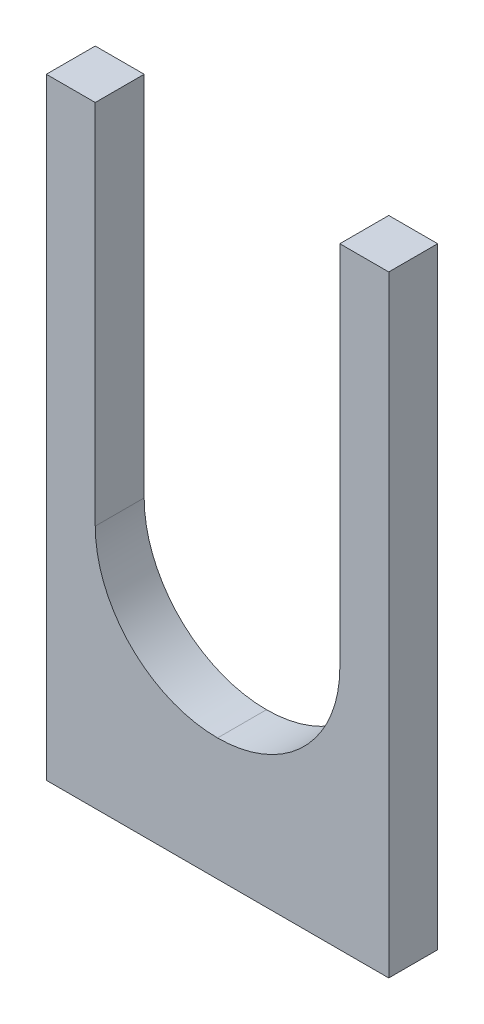
ISO-10303-21;
HEADER;
FILE_DESCRIPTION(('STEP AP214'),'2;1');
FILE_NAME('part.step','',(''),(''),'','','');
FILE_SCHEMA(('AUTOMOTIVE_DESIGN { 1 0 10303 214 1 1 1 1 }'));
ENDSEC;
DATA;
#1=APPLICATION_CONTEXT('core data for automotive mechanical design processes');
#2=APPLICATION_PROTOCOL_DEFINITION('international standard','automotive_design',2000,#1);
#3=PRODUCT_CONTEXT('',#1,'mechanical');
#4=PRODUCT('Part','Part','',(#3));
#5=PRODUCT_RELATED_PRODUCT_CATEGORY('part','',(#4));
#6=PRODUCT_DEFINITION_FORMATION('','',#4);
#7=PRODUCT_DEFINITION_CONTEXT('part definition',#1,'design');
#8=PRODUCT_DEFINITION('design','',#6,#7);
#9=PRODUCT_DEFINITION_SHAPE('','',#8);
#10=(LENGTH_UNIT() NAMED_UNIT(*) SI_UNIT(.MILLI.,.METRE.));
#11=(NAMED_UNIT(*) PLANE_ANGLE_UNIT() SI_UNIT($,.RADIAN.));
#12=(NAMED_UNIT(*) SI_UNIT($,.STERADIAN.) SOLID_ANGLE_UNIT());
#13=UNCERTAINTY_MEASURE_WITH_UNIT(LENGTH_MEASURE(1.E-05),#10,'distance_accuracy_value','');
#14=(GEOMETRIC_REPRESENTATION_CONTEXT(3) GLOBAL_UNCERTAINTY_ASSIGNED_CONTEXT((#13)) GLOBAL_UNIT_ASSIGNED_CONTEXT((#10,
#11,#12)) REPRESENTATION_CONTEXT('',''));
#15=CARTESIAN_POINT('',(0.,0.,0.));
#16=DIRECTION('',(0.,0.,1.));
#17=DIRECTION('',(1.,0.,0.));
#18=AXIS2_PLACEMENT_3D('',#15,#16,#17);
#19=CARTESIAN_POINT('',(35.,0.,10.));
#20=DIRECTION('',(-1.,0.,0.));
#21=DIRECTION('',(0.,0.,1.));
#22=AXIS2_PLACEMENT_3D('',#19,#20,#21);
#23=PLANE('',#22);
#24=DIRECTION('',(0.,1.,0.));
#25=VECTOR('',#24,1.);
#26=CARTESIAN_POINT('',(35.,0.,0.));
#27=LINE('',#26,#25);
#28=CARTESIAN_POINT('',(35.,-75.,0.));
#29=VERTEX_POINT('',#28);
#30=CARTESIAN_POINT('',(35.,50.,0.));
#31=VERTEX_POINT('',#30);
#32=EDGE_CURVE('E136',#29,#31,#27,.T.);
#33=ORIENTED_EDGE('',*,*,#32,.T.);
#34=DIRECTION('',(0.,0.,-1.));
#35=VECTOR('',#34,1.);
#36=CARTESIAN_POINT('',(35.,50.,10.));
#37=LINE('',#36,#35);
#38=CARTESIAN_POINT('',(35.,50.,10.));
#39=VERTEX_POINT('',#38);
#40=EDGE_CURVE('E117',#39,#31,#37,.T.);
#41=ORIENTED_EDGE('',*,*,#40,.F.);
#42=DIRECTION('',(0.,1.,0.));
#43=VECTOR('',#42,1.);
#44=CARTESIAN_POINT('',(35.,0.,10.));
#45=LINE('',#44,#43);
#46=CARTESIAN_POINT('',(35.,-75.,10.));
#47=VERTEX_POINT('',#46);
#48=EDGE_CURVE('E123',#47,#39,#45,.T.);
#49=ORIENTED_EDGE('',*,*,#48,.F.);
#50=DIRECTION('',(0.,0.,-1.));
#51=VECTOR('',#50,1.);
#52=CARTESIAN_POINT('',(35.,-75.,10.));
#53=LINE('',#52,#51);
#54=EDGE_CURVE('E190',#47,#29,#53,.T.);
#55=ORIENTED_EDGE('',*,*,#54,.T.);
#56=EDGE_LOOP('',(#33,#41,#49,#55));
#57=FACE_BOUND('',#56,.T.);
#58=ADVANCED_FACE('F39',(#57),#23,.F.);
#59=CARTESIAN_POINT('',(0.,50.,10.));
#60=DIRECTION('',(0.,-1.,0.));
#61=DIRECTION('',(0.,0.,-1.));
#62=AXIS2_PLACEMENT_3D('',#59,#60,#61);
#63=PLANE('',#62);
#64=DIRECTION('',(-1.,0.,0.));
#65=VECTOR('',#64,1.);
#66=CARTESIAN_POINT('',(0.,50.,0.));
#67=LINE('',#66,#65);
#68=CARTESIAN_POINT('',(25.,50.,0.));
#69=VERTEX_POINT('',#68);
#70=EDGE_CURVE('E168',#31,#69,#67,.T.);
#71=ORIENTED_EDGE('',*,*,#70,.T.);
#72=DIRECTION('',(0.,0.,-1.));
#73=VECTOR('',#72,1.);
#74=CARTESIAN_POINT('',(25.,50.,10.));
#75=LINE('',#74,#73);
#76=CARTESIAN_POINT('',(25.,50.,10.));
#77=VERTEX_POINT('',#76);
#78=EDGE_CURVE('E120',#77,#69,#75,.T.);
#79=ORIENTED_EDGE('',*,*,#78,.F.);
#80=DIRECTION('',(-1.,0.,0.));
#81=VECTOR('',#80,1.);
#82=CARTESIAN_POINT('',(0.,50.,10.));
#83=LINE('',#82,#81);
#84=EDGE_CURVE('E112',#39,#77,#83,.T.);
#85=ORIENTED_EDGE('',*,*,#84,.F.);
#86=ORIENTED_EDGE('',*,*,#40,.T.);
#87=EDGE_LOOP('',(#71,#79,#85,#86));
#88=FACE_BOUND('',#87,.T.);
#89=ADVANCED_FACE('F115',(#88),#63,.F.);
#90=CARTESIAN_POINT('',(25.,0.,10.));
#91=DIRECTION('',(-1.,0.,0.));
#92=DIRECTION('',(0.,0.,1.));
#93=AXIS2_PLACEMENT_3D('',#90,#91,#92);
#94=PLANE('',#93);
#95=DIRECTION('',(0.,1.,0.));
#96=VECTOR('',#95,1.);
#97=CARTESIAN_POINT('',(25.,0.,0.));
#98=LINE('',#97,#96);
#99=CARTESIAN_POINT('',(25.,-25.,0.));
#100=VERTEX_POINT('',#99);
#101=EDGE_CURVE('E160',#100,#69,#98,.T.);
#102=ORIENTED_EDGE('',*,*,#101,.F.);
#103=DIRECTION('',(0.,0.,-1.));
#104=VECTOR('',#103,1.);
#105=CARTESIAN_POINT('',(25.,-25.,10.));
#106=LINE('',#105,#104);
#107=CARTESIAN_POINT('',(25.,-25.,10.));
#108=VERTEX_POINT('',#107);
#109=EDGE_CURVE('E138',#100,#108,#106,.F.);
#110=ORIENTED_EDGE('',*,*,#109,.T.);
#111=DIRECTION('',(0.,1.,0.));
#112=VECTOR('',#111,1.);
#113=CARTESIAN_POINT('',(25.,0.,10.));
#114=LINE('',#113,#112);
#115=EDGE_CURVE('E122',#108,#77,#114,.T.);
#116=ORIENTED_EDGE('',*,*,#115,.T.);
#117=ORIENTED_EDGE('',*,*,#78,.T.);
#118=EDGE_LOOP('',(#102,#110,#116,#117));
#119=FACE_BOUND('',#118,.T.);
#120=ADVANCED_FACE('F165',(#119),#94,.T.);
#121=CARTESIAN_POINT('',(-25.,0.,10.));
#122=DIRECTION('',(-1.,0.,0.));
#123=DIRECTION('',(0.,0.,1.));
#124=AXIS2_PLACEMENT_3D('',#121,#122,#123);
#125=PLANE('',#124);
#126=DIRECTION('',(0.,1.,0.));
#127=VECTOR('',#126,1.);
#128=CARTESIAN_POINT('',(-25.,0.,10.));
#129=LINE('',#128,#127);
#130=CARTESIAN_POINT('',(-25.,-25.,10.));
#131=VERTEX_POINT('',#130);
#132=CARTESIAN_POINT('',(-25.,50.,10.));
#133=VERTEX_POINT('',#132);
#134=EDGE_CURVE('E223',#131,#133,#129,.T.);
#135=ORIENTED_EDGE('',*,*,#134,.F.);
#136=DIRECTION('',(0.,0.,-1.));
#137=VECTOR('',#136,1.);
#138=CARTESIAN_POINT('',(-25.,-25.,10.));
#139=LINE('',#138,#137);
#140=CARTESIAN_POINT('',(-25.,-25.,0.));
#141=VERTEX_POINT('',#140);
#142=EDGE_CURVE('E143',#131,#141,#139,.T.);
#143=ORIENTED_EDGE('',*,*,#142,.T.);
#144=DIRECTION('',(0.,1.,0.));
#145=VECTOR('',#144,1.);
#146=CARTESIAN_POINT('',(-25.,0.,0.));
#147=LINE('',#146,#145);
#148=CARTESIAN_POINT('',(-25.,50.,0.));
#149=VERTEX_POINT('',#148);
#150=EDGE_CURVE('E167',#141,#149,#147,.T.);
#151=ORIENTED_EDGE('',*,*,#150,.T.);
#152=DIRECTION('',(0.,0.,-1.));
#153=VECTOR('',#152,1.);
#154=CARTESIAN_POINT('',(-25.,50.,10.));
#155=LINE('',#154,#153);
#156=EDGE_CURVE('E145',#133,#149,#155,.T.);
#157=ORIENTED_EDGE('',*,*,#156,.F.);
#158=EDGE_LOOP('',(#135,#143,#151,#157));
#159=FACE_BOUND('',#158,.T.);
#160=ADVANCED_FACE('F230',(#159),#125,.F.);
#161=CARTESIAN_POINT('',(0.,50.,10.));
#162=DIRECTION('',(0.,-1.,0.));
#163=DIRECTION('',(0.,0.,-1.));
#164=AXIS2_PLACEMENT_3D('',#161,#162,#163);
#165=PLANE('',#164);
#166=DIRECTION('',(-1.,0.,0.));
#167=VECTOR('',#166,1.);
#168=CARTESIAN_POINT('',(0.,50.,0.));
#169=LINE('',#168,#167);
#170=CARTESIAN_POINT('',(-35.,50.,0.));
#171=VERTEX_POINT('',#170);
#172=EDGE_CURVE('E182',#149,#171,#169,.T.);
#173=ORIENTED_EDGE('',*,*,#172,.T.);
#174=DIRECTION('',(0.,0.,-1.));
#175=VECTOR('',#174,1.);
#176=CARTESIAN_POINT('',(-35.,50.,10.));
#177=LINE('',#176,#175);
#178=CARTESIAN_POINT('',(-35.,50.,10.));
#179=VERTEX_POINT('',#178);
#180=EDGE_CURVE('E197',#179,#171,#177,.T.);
#181=ORIENTED_EDGE('',*,*,#180,.F.);
#182=DIRECTION('',(-1.,0.,0.));
#183=VECTOR('',#182,1.);
#184=CARTESIAN_POINT('',(0.,50.,10.));
#185=LINE('',#184,#183);
#186=EDGE_CURVE('E208',#133,#179,#185,.T.);
#187=ORIENTED_EDGE('',*,*,#186,.F.);
#188=ORIENTED_EDGE('',*,*,#156,.T.);
#189=EDGE_LOOP('',(#173,#181,#187,#188));
#190=FACE_BOUND('',#189,.T.);
#191=ADVANCED_FACE('F206',(#190),#165,.F.);
#192=CARTESIAN_POINT('',(-35.,0.,10.));
#193=DIRECTION('',(1.,0.,0.));
#194=DIRECTION('',(0.,0.,-1.));
#195=AXIS2_PLACEMENT_3D('',#192,#193,#194);
#196=PLANE('',#195);
#197=DIRECTION('',(0.,-1.,0.));
#198=VECTOR('',#197,1.);
#199=CARTESIAN_POINT('',(-35.,0.,0.));
#200=LINE('',#199,#198);
#201=CARTESIAN_POINT('',(-35.,-75.,0.));
#202=VERTEX_POINT('',#201);
#203=EDGE_CURVE('E185',#171,#202,#200,.T.);
#204=ORIENTED_EDGE('',*,*,#203,.T.);
#205=DIRECTION('',(0.,0.,-1.));
#206=VECTOR('',#205,1.);
#207=CARTESIAN_POINT('',(-35.,-75.,10.));
#208=LINE('',#207,#206);
#209=CARTESIAN_POINT('',(-35.,-75.,10.));
#210=VERTEX_POINT('',#209);
#211=EDGE_CURVE('E193',#210,#202,#208,.T.);
#212=ORIENTED_EDGE('',*,*,#211,.F.);
#213=DIRECTION('',(0.,-1.,0.));
#214=VECTOR('',#213,1.);
#215=CARTESIAN_POINT('',(-35.,0.,10.));
#216=LINE('',#215,#214);
#217=EDGE_CURVE('E220',#179,#210,#216,.T.);
#218=ORIENTED_EDGE('',*,*,#217,.F.);
#219=ORIENTED_EDGE('',*,*,#180,.T.);
#220=EDGE_LOOP('',(#204,#212,#218,#219));
#221=FACE_BOUND('',#220,.T.);
#222=ADVANCED_FACE('F215',(#221),#196,.F.);
#223=CARTESIAN_POINT('',(0.,-75.,10.));
#224=DIRECTION('',(0.,1.,0.));
#225=DIRECTION('',(0.,0.,1.));
#226=AXIS2_PLACEMENT_3D('',#223,#224,#225);
#227=PLANE('',#226);
#228=DIRECTION('',(1.,0.,0.));
#229=VECTOR('',#228,1.);
#230=CARTESIAN_POINT('',(0.,-75.,0.));
#231=LINE('',#230,#229);
#232=EDGE_CURVE('E133',#202,#29,#231,.T.);
#233=ORIENTED_EDGE('',*,*,#232,.T.);
#234=ORIENTED_EDGE('',*,*,#54,.F.);
#235=DIRECTION('',(1.,0.,0.));
#236=VECTOR('',#235,1.);
#237=CARTESIAN_POINT('',(0.,-75.,10.));
#238=LINE('',#237,#236);
#239=EDGE_CURVE('E128',#210,#47,#238,.T.);
#240=ORIENTED_EDGE('',*,*,#239,.F.);
#241=ORIENTED_EDGE('',*,*,#211,.T.);
#242=EDGE_LOOP('',(#233,#234,#240,#241));
#243=FACE_BOUND('',#242,.T.);
#244=ADVANCED_FACE('F218',(#243),#227,.F.);
#245=CARTESIAN_POINT('',(0.,0.,10.));
#246=DIRECTION('',(0.,0.,1.));
#247=DIRECTION('',(1.,0.,0.));
#248=AXIS2_PLACEMENT_3D('',#245,#246,#247);
#249=PLANE('',#248);
#250=ORIENTED_EDGE('',*,*,#48,.T.);
#251=ORIENTED_EDGE('',*,*,#84,.T.);
#252=ORIENTED_EDGE('',*,*,#115,.F.);
#253=CARTESIAN_POINT('',(0.,-25.,10.));
#254=DIRECTION('',(0.,0.,1.));
#255=DIRECTION('',(1.,0.,0.));
#256=AXIS2_PLACEMENT_3D('',#253,#254,#255);
#257=CIRCLE('',#256,25.);
#258=CARTESIAN_POINT('',(0.,-50.,10.));
#259=VERTEX_POINT('',#258);
#260=EDGE_CURVE('E55',#108,#259,#257,.F.);
#261=ORIENTED_EDGE('',*,*,#260,.T.);
#262=CARTESIAN_POINT('',(0.,-25.,10.));
#263=DIRECTION('',(0.,0.,1.));
#264=DIRECTION('',(1.,0.,0.));
#265=AXIS2_PLACEMENT_3D('',#262,#263,#264);
#266=CIRCLE('',#265,25.);
#267=EDGE_CURVE('E11',#259,#131,#266,.F.);
#268=ORIENTED_EDGE('',*,*,#267,.T.);
#269=ORIENTED_EDGE('',*,*,#134,.T.);
#270=ORIENTED_EDGE('',*,*,#186,.T.);
#271=ORIENTED_EDGE('',*,*,#217,.T.);
#272=ORIENTED_EDGE('',*,*,#239,.T.);
#273=EDGE_LOOP('',(#250,#251,#252,#261,#268,#269,#270,#271,#272));
#274=FACE_BOUND('',#273,.T.);
#275=ADVANCED_FACE('F126',(#274),#249,.T.);
#276=CARTESIAN_POINT('',(0.,0.,0.));
#277=DIRECTION('',(0.,0.,1.));
#278=DIRECTION('',(1.,0.,0.));
#279=AXIS2_PLACEMENT_3D('',#276,#277,#278);
#280=PLANE('',#279);
#281=ORIENTED_EDGE('',*,*,#32,.F.);
#282=ORIENTED_EDGE('',*,*,#232,.F.);
#283=ORIENTED_EDGE('',*,*,#203,.F.);
#284=ORIENTED_EDGE('',*,*,#172,.F.);
#285=ORIENTED_EDGE('',*,*,#150,.F.);
#286=CARTESIAN_POINT('',(0.,-25.,0.));
#287=DIRECTION('',(0.,0.,1.));
#288=DIRECTION('',(1.,0.,0.));
#289=AXIS2_PLACEMENT_3D('',#286,#287,#288);
#290=CIRCLE('',#289,25.);
#291=CARTESIAN_POINT('',(0.,-50.,0.));
#292=VERTEX_POINT('',#291);
#293=EDGE_CURVE('E49',#141,#292,#290,.T.);
#294=ORIENTED_EDGE('',*,*,#293,.T.);
#295=CARTESIAN_POINT('',(0.,-25.,0.));
#296=DIRECTION('',(0.,0.,1.));
#297=DIRECTION('',(1.,0.,0.));
#298=AXIS2_PLACEMENT_3D('',#295,#296,#297);
#299=CIRCLE('',#298,25.);
#300=EDGE_CURVE('E151',#292,#100,#299,.T.);
#301=ORIENTED_EDGE('',*,*,#300,.T.);
#302=ORIENTED_EDGE('',*,*,#101,.T.);
#303=ORIENTED_EDGE('',*,*,#70,.F.);
#304=EDGE_LOOP('',(#281,#282,#283,#284,#285,#294,#301,#302,#303));
#305=FACE_BOUND('',#304,.T.);
#306=ADVANCED_FACE('F159',(#305),#280,.F.);
#307=CARTESIAN_POINT('',(0.,-25.,10.));
#308=DIRECTION('',(0.,0.,-1.));
#309=DIRECTION('',(-1.,0.,0.));
#310=AXIS2_PLACEMENT_3D('',#307,#308,#309);
#311=CYLINDRICAL_SURFACE('',#310,25.);
#312=ORIENTED_EDGE('',*,*,#142,.F.);
#313=ORIENTED_EDGE('',*,*,#267,.F.);
#314=DIRECTION('',(0.,0.,-1.));
#315=VECTOR('',#314,1.);
#316=CARTESIAN_POINT('',(0.,-50.,10.));
#317=LINE('',#316,#315);
#318=EDGE_CURVE('E43',#292,#259,#317,.F.);
#319=ORIENTED_EDGE('',*,*,#318,.F.);
#320=ORIENTED_EDGE('',*,*,#293,.F.);
#321=EDGE_LOOP('',(#312,#313,#319,#320));
#322=FACE_BOUND('',#321,.T.);
#323=ADVANCED_FACE('F41',(#322),#311,.F.);
#324=CARTESIAN_POINT('',(0.,-25.,10.));
#325=DIRECTION('',(0.,0.,1.));
#326=DIRECTION('',(1.,0.,0.));
#327=AXIS2_PLACEMENT_3D('',#324,#325,#326);
#328=CYLINDRICAL_SURFACE('',#327,25.);
#329=ORIENTED_EDGE('',*,*,#260,.F.);
#330=ORIENTED_EDGE('',*,*,#109,.F.);
#331=ORIENTED_EDGE('',*,*,#300,.F.);
#332=ORIENTED_EDGE('',*,*,#318,.T.);
#333=EDGE_LOOP('',(#329,#330,#331,#332));
#334=FACE_BOUND('',#333,.T.);
#335=ADVANCED_FACE('F170',(#334),#328,.F.);
#336=CLOSED_SHELL('',(#58,#89,#120,#160,#191,#222,#244,#275,#306,#323,#335));
#337=MANIFOLD_SOLID_BREP('B2',#336);
#338=ADVANCED_BREP_SHAPE_REPRESENTATION('',(#18,#337),#14);
#339=SHAPE_DEFINITION_REPRESENTATION(#9,#338);
ENDSEC;
END-ISO-10303-21;
